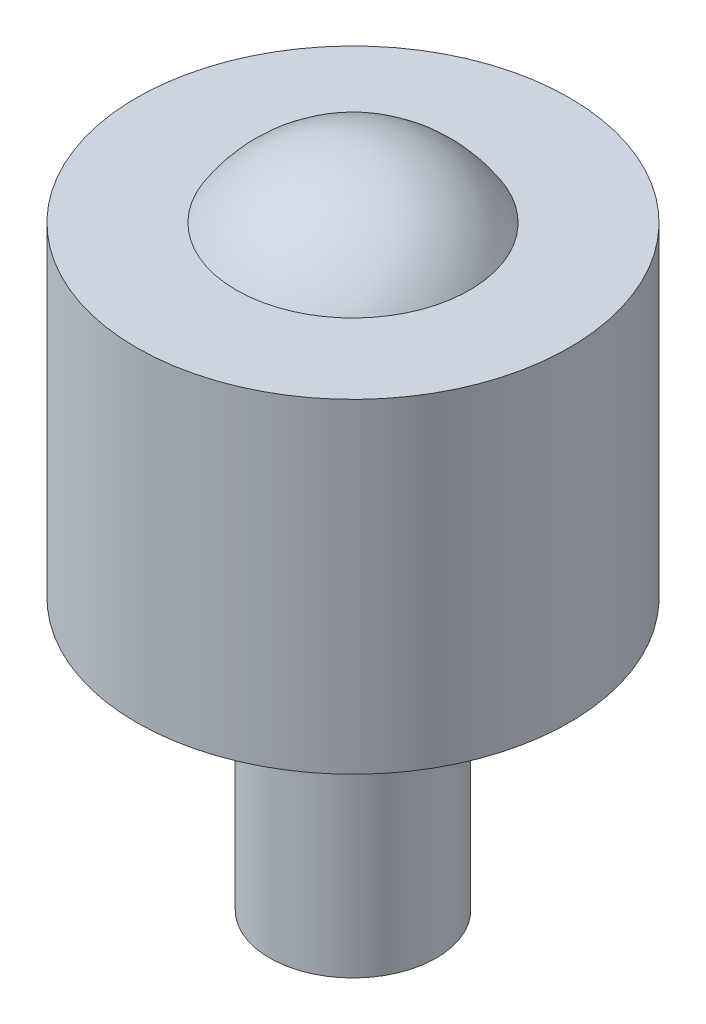
ISO-10303-21;
HEADER;
FILE_DESCRIPTION(('STEP AP214'),'2;1');
FILE_NAME('part.step','',(''),(''),'','','');
FILE_SCHEMA(('AUTOMOTIVE_DESIGN { 1 0 10303 214 1 1 1 1 }'));
ENDSEC;
DATA;
#1=APPLICATION_CONTEXT('core data for automotive mechanical design processes');
#2=APPLICATION_PROTOCOL_DEFINITION('international standard','automotive_design',2000,#1);
#3=PRODUCT_CONTEXT('',#1,'mechanical');
#4=PRODUCT('Part','Part','',(#3));
#5=PRODUCT_RELATED_PRODUCT_CATEGORY('part','',(#4));
#6=PRODUCT_DEFINITION_FORMATION('','',#4);
#7=PRODUCT_DEFINITION_CONTEXT('part definition',#1,'design');
#8=PRODUCT_DEFINITION('design','',#6,#7);
#9=PRODUCT_DEFINITION_SHAPE('','',#8);
#10=(LENGTH_UNIT() NAMED_UNIT(*) SI_UNIT(.MILLI.,.METRE.));
#11=(NAMED_UNIT(*) PLANE_ANGLE_UNIT() SI_UNIT($,.RADIAN.));
#12=(NAMED_UNIT(*) SI_UNIT($,.STERADIAN.) SOLID_ANGLE_UNIT());
#13=UNCERTAINTY_MEASURE_WITH_UNIT(LENGTH_MEASURE(1.E-05),#10,'distance_accuracy_value','');
#14=(GEOMETRIC_REPRESENTATION_CONTEXT(3) GLOBAL_UNCERTAINTY_ASSIGNED_CONTEXT((#13)) GLOBAL_UNIT_ASSIGNED_CONTEXT((#10,
#11,#12)) REPRESENTATION_CONTEXT('',''));
#15=CARTESIAN_POINT('',(0.,0.,0.));
#16=DIRECTION('',(0.,0.,1.));
#17=DIRECTION('',(1.,0.,0.));
#18=AXIS2_PLACEMENT_3D('',#15,#16,#17);
#19=CARTESIAN_POINT('',(0.,11.65,0.));
#20=DIRECTION('',(0.,-1.,0.));
#21=DIRECTION('',(0.,0.,1.));
#22=AXIS2_PLACEMENT_3D('',#19,#20,#21);
#23=SPHERICAL_SURFACE('',#22,6.35);
#24=CARTESIAN_POINT('',(0.,5.3,0.));
#25=VERTEX_POINT('',#24);
#26=VERTEX_LOOP('',#25);
#27=FACE_BOUND('',#26,.T.);
#28=ADVANCED_FACE('F36',(#27),#23,.T.);
#29=CLOSED_SHELL('',(#28));
#30=MANIFOLD_SOLID_BREP('B2',#29);
#31=CARTESIAN_POINT('',(0.,15.,0.));
#32=DIRECTION('',(0.,-1.,0.));
#33=DIRECTION('',(0.,0.,-1.));
#34=AXIS2_PLACEMENT_3D('',#31,#32,#33);
#35=CYLINDRICAL_SURFACE('',#34,10.);
#36=CARTESIAN_POINT('',(0.,15.,0.));
#37=DIRECTION('',(0.,1.,0.));
#38=DIRECTION('',(0.,0.,1.));
#39=AXIS2_PLACEMENT_3D('',#36,#37,#38);
#40=CIRCLE('',#39,10.);
#41=CARTESIAN_POINT('',(0.,15.,10.));
#42=VERTEX_POINT('',#41);
#43=EDGE_CURVE('E55',#42,#42,#40,.T.);
#44=ORIENTED_EDGE('',*,*,#43,.F.);
#45=EDGE_LOOP('',(#44));
#46=FACE_BOUND('',#45,.T.);
#47=CARTESIAN_POINT('',(0.,0.,0.));
#48=DIRECTION('',(0.,1.,0.));
#49=DIRECTION('',(0.,0.,1.));
#50=AXIS2_PLACEMENT_3D('',#47,#48,#49);
#51=CIRCLE('',#50,10.);
#52=CARTESIAN_POINT('',(0.,0.,10.));
#53=VERTEX_POINT('',#52);
#54=EDGE_CURVE('E51',#53,#53,#51,.T.);
#55=ORIENTED_EDGE('',*,*,#54,.T.);
#56=EDGE_LOOP('',(#55));
#57=FACE_BOUND('',#56,.T.);
#58=ADVANCED_FACE('F48',(#46,#57),#35,.T.);
#59=CARTESIAN_POINT('',(0.,15.,0.));
#60=DIRECTION('',(0.,1.,0.));
#61=DIRECTION('',(0.,0.,1.));
#62=AXIS2_PLACEMENT_3D('',#59,#60,#61);
#63=PLANE('',#62);
#64=ORIENTED_EDGE('',*,*,#43,.T.);
#65=EDGE_LOOP('',(#64));
#66=FACE_BOUND('',#65,.T.);
#67=ADVANCED_FACE('F72',(#66),#63,.T.);
#68=CARTESIAN_POINT('',(0.,0.,0.));
#69=DIRECTION('',(0.,1.,0.));
#70=DIRECTION('',(0.,0.,1.));
#71=AXIS2_PLACEMENT_3D('',#68,#69,#70);
#72=PLANE('',#71);
#73=CARTESIAN_POINT('',(0.,0.,0.));
#74=DIRECTION('',(0.,-1.,0.));
#75=DIRECTION('',(0.,0.,-1.));
#76=AXIS2_PLACEMENT_3D('',#73,#74,#75);
#77=CIRCLE('',#76,3.85);
#78=CARTESIAN_POINT('',(0.,0.,-3.85));
#79=VERTEX_POINT('',#78);
#80=EDGE_CURVE('E35',#79,#79,#77,.T.);
#81=ORIENTED_EDGE('',*,*,#80,.F.);
#82=EDGE_LOOP('',(#81));
#83=FACE_BOUND('',#82,.T.);
#84=ORIENTED_EDGE('',*,*,#54,.F.);
#85=EDGE_LOOP('',(#84));
#86=FACE_BOUND('',#85,.T.);
#87=ADVANCED_FACE('F69',(#83,#86),#72,.F.);
#88=CARTESIAN_POINT('',(0.,-12.5,0.));
#89=DIRECTION('',(0.,1.,0.));
#90=DIRECTION('',(0.,0.,1.));
#91=AXIS2_PLACEMENT_3D('',#88,#89,#90);
#92=CYLINDRICAL_SURFACE('',#91,3.85);
#93=CARTESIAN_POINT('',(0.,-12.5,0.));
#94=DIRECTION('',(0.,-1.,0.));
#95=DIRECTION('',(0.,0.,-1.));
#96=AXIS2_PLACEMENT_3D('',#93,#94,#95);
#97=CIRCLE('',#96,3.85);
#98=CARTESIAN_POINT('',(0.,-12.5,-3.85));
#99=VERTEX_POINT('',#98);
#100=EDGE_CURVE('E61',#99,#99,#97,.T.);
#101=ORIENTED_EDGE('',*,*,#100,.F.);
#102=EDGE_LOOP('',(#101));
#103=FACE_BOUND('',#102,.T.);
#104=ORIENTED_EDGE('',*,*,#80,.T.);
#105=EDGE_LOOP('',(#104));
#106=FACE_BOUND('',#105,.T.);
#107=ADVANCED_FACE('F71',(#103,#106),#92,.T.);
#108=CARTESIAN_POINT('',(0.,-12.5,0.));
#109=DIRECTION('',(0.,-1.,0.));
#110=DIRECTION('',(0.,0.,-1.));
#111=AXIS2_PLACEMENT_3D('',#108,#109,#110);
#112=PLANE('',#111);
#113=ORIENTED_EDGE('',*,*,#100,.T.);
#114=EDGE_LOOP('',(#113));
#115=FACE_BOUND('',#114,.T.);
#116=ADVANCED_FACE('F78',(#115),#112,.T.);
#117=CLOSED_SHELL('',(#58,#67,#87,#107,#116));
#118=MANIFOLD_SOLID_BREP('B6',#117);
#119=ADVANCED_BREP_SHAPE_REPRESENTATION('',(#18,#30,#118),#14);
#120=SHAPE_DEFINITION_REPRESENTATION(#9,#119);
ENDSEC;
END-ISO-10303-21;
